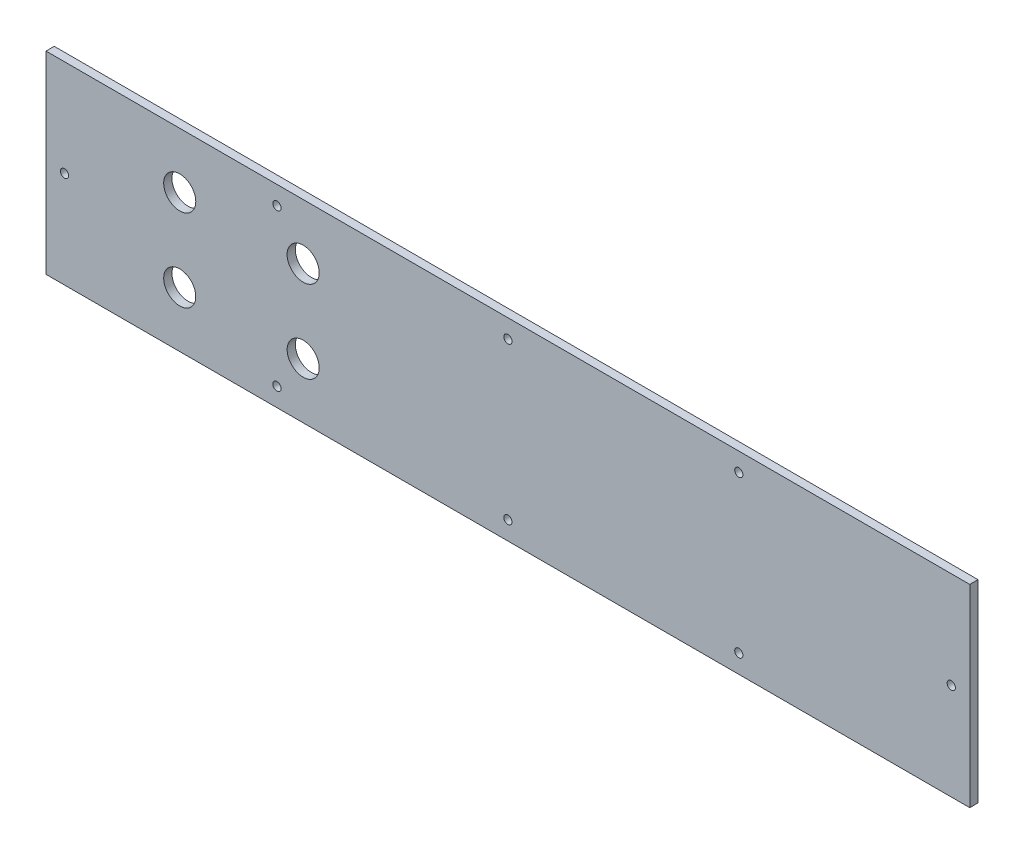
ISO-10303-21;
HEADER;
FILE_DESCRIPTION(('STEP AP214'),'2;1');
FILE_NAME('part.step','',(''),(''),'','','');
FILE_SCHEMA(('AUTOMOTIVE_DESIGN { 1 0 10303 214 1 1 1 1 }'));
ENDSEC;
DATA;
#1=APPLICATION_CONTEXT('core data for automotive mechanical design processes');
#2=APPLICATION_PROTOCOL_DEFINITION('international standard','automotive_design',2000,#1);
#3=PRODUCT_CONTEXT('',#1,'mechanical');
#4=PRODUCT('Part','Part','',(#3));
#5=PRODUCT_RELATED_PRODUCT_CATEGORY('part','',(#4));
#6=PRODUCT_DEFINITION_FORMATION('','',#4);
#7=PRODUCT_DEFINITION_CONTEXT('part definition',#1,'design');
#8=PRODUCT_DEFINITION('design','',#6,#7);
#9=PRODUCT_DEFINITION_SHAPE('','',#8);
#10=(LENGTH_UNIT() NAMED_UNIT(*) SI_UNIT(.MILLI.,.METRE.));
#11=(NAMED_UNIT(*) PLANE_ANGLE_UNIT() SI_UNIT($,.RADIAN.));
#12=(NAMED_UNIT(*) SI_UNIT($,.STERADIAN.) SOLID_ANGLE_UNIT());
#13=UNCERTAINTY_MEASURE_WITH_UNIT(LENGTH_MEASURE(1.E-05),#10,'distance_accuracy_value','');
#14=(GEOMETRIC_REPRESENTATION_CONTEXT(3) GLOBAL_UNCERTAINTY_ASSIGNED_CONTEXT((#13)) GLOBAL_UNIT_ASSIGNED_CONTEXT((#10,
#11,#12)) REPRESENTATION_CONTEXT('',''));
#15=CARTESIAN_POINT('',(0.,0.,0.));
#16=DIRECTION('',(0.,0.,1.));
#17=DIRECTION('',(1.,0.,0.));
#18=AXIS2_PLACEMENT_3D('',#15,#16,#17);
#19=CARTESIAN_POINT('',(0.,0.,4.));
#20=DIRECTION('',(0.,0.,1.));
#21=DIRECTION('',(1.,0.,0.));
#22=AXIS2_PLACEMENT_3D('',#19,#20,#21);
#23=PLANE('',#22);
#24=CARTESIAN_POINT('',(-112.25,8.99999999999618,4.));
#25=DIRECTION('',(0.,0.,1.));
#26=DIRECTION('',(1.,0.,0.));
#27=AXIS2_PLACEMENT_3D('',#24,#25,#26);
#28=CIRCLE('',#27,2.);
#29=CARTESIAN_POINT('',(-110.25,8.99999999999618,4.));
#30=VERTEX_POINT('',#29);
#31=EDGE_CURVE('E171',#30,#30,#28,.T.);
#32=ORIENTED_EDGE('',*,*,#31,.F.);
#33=EDGE_LOOP('',(#32));
#34=FACE_BOUND('',#33,.T.);
#35=CARTESIAN_POINT('',(-336.75,85.0000000000039,4.));
#36=DIRECTION('',(0.,0.,1.));
#37=DIRECTION('',(1.,0.,0.));
#38=AXIS2_PLACEMENT_3D('',#35,#36,#37);
#39=CIRCLE('',#38,2.);
#40=CARTESIAN_POINT('',(-334.75,85.0000000000039,4.));
#41=VERTEX_POINT('',#40);
#42=EDGE_CURVE('E159',#41,#41,#39,.T.);
#43=ORIENTED_EDGE('',*,*,#42,.F.);
#44=EDGE_LOOP('',(#43));
#45=FACE_BOUND('',#44,.T.);
#46=CARTESIAN_POINT('',(-384.,66.9999999999999,4.));
#47=DIRECTION('',(0.,0.,1.));
#48=DIRECTION('',(1.,0.,0.));
#49=AXIS2_PLACEMENT_3D('',#46,#47,#48);
#50=CIRCLE('',#49,7.79999999999999);
#51=CARTESIAN_POINT('',(-376.2,66.9999999999999,4.));
#52=VERTEX_POINT('',#51);
#53=EDGE_CURVE('E147',#52,#52,#50,.T.);
#54=ORIENTED_EDGE('',*,*,#53,.F.);
#55=EDGE_LOOP('',(#54));
#56=FACE_BOUND('',#55,.T.);
#57=CARTESIAN_POINT('',(-224.5,8.99999999999998,4.));
#58=DIRECTION('',(0.,0.,1.));
#59=DIRECTION('',(-1.,0.,0.));
#60=AXIS2_PLACEMENT_3D('',#57,#58,#59);
#61=CIRCLE('',#60,2.);
#62=CARTESIAN_POINT('',(-226.5,8.99999999999998,4.));
#63=VERTEX_POINT('',#62);
#64=EDGE_CURVE('E135',#63,#63,#61,.T.);
#65=ORIENTED_EDGE('',*,*,#64,.F.);
#66=EDGE_LOOP('',(#65));
#67=FACE_BOUND('',#66,.T.);
#68=CARTESIAN_POINT('',(-9.,46.9999999999999,4.));
#69=DIRECTION('',(0.,0.,1.));
#70=DIRECTION('',(1.,0.,0.));
#71=AXIS2_PLACEMENT_3D('',#68,#69,#70);
#72=CIRCLE('',#71,2.);
#73=CARTESIAN_POINT('',(-7.,46.9999999999999,4.));
#74=VERTEX_POINT('',#73);
#75=EDGE_CURVE('E123',#74,#74,#72,.T.);
#76=ORIENTED_EDGE('',*,*,#75,.F.);
#77=EDGE_LOOP('',(#76));
#78=FACE_BOUND('',#77,.T.);
#79=CARTESIAN_POINT('',(-384.,26.9999999999999,4.));
#80=DIRECTION('',(0.,0.,1.));
#81=DIRECTION('',(-1.,0.,0.));
#82=AXIS2_PLACEMENT_3D('',#79,#80,#81);
#83=CIRCLE('',#82,7.79999999999999);
#84=CARTESIAN_POINT('',(-391.8,26.9999999999999,4.));
#85=VERTEX_POINT('',#84);
#86=EDGE_CURVE('E102',#85,#85,#83,.T.);
#87=ORIENTED_EDGE('',*,*,#86,.F.);
#88=EDGE_LOOP('',(#87));
#89=FACE_BOUND('',#88,.T.);
#90=DIRECTION('',(0.,1.,0.));
#91=VECTOR('',#90,1.);
#92=CARTESIAN_POINT('',(0.,0.,4.));
#93=LINE('',#92,#91);
#94=CARTESIAN_POINT('',(0.,0.,4.));
#95=VERTEX_POINT('',#94);
#96=CARTESIAN_POINT('',(0.,93.9999999999999,4.));
#97=VERTEX_POINT('',#96);
#98=EDGE_CURVE('E87',#95,#97,#93,.T.);
#99=ORIENTED_EDGE('',*,*,#98,.T.);
#100=DIRECTION('',(-1.,0.,0.));
#101=VECTOR('',#100,1.);
#102=CARTESIAN_POINT('',(0.,93.9999999999999,4.));
#103=LINE('',#102,#101);
#104=CARTESIAN_POINT('',(-449.,93.9999999999999,4.));
#105=VERTEX_POINT('',#104);
#106=EDGE_CURVE('E82',#97,#105,#103,.T.);
#107=ORIENTED_EDGE('',*,*,#106,.T.);
#108=DIRECTION('',(0.,-1.,0.));
#109=VECTOR('',#108,1.);
#110=CARTESIAN_POINT('',(-449.,0.,4.));
#111=LINE('',#110,#109);
#112=CARTESIAN_POINT('',(-449.,0.,4.));
#113=VERTEX_POINT('',#112);
#114=EDGE_CURVE('E85',#105,#113,#111,.T.);
#115=ORIENTED_EDGE('',*,*,#114,.T.);
#116=DIRECTION('',(1.,0.,0.));
#117=VECTOR('',#116,1.);
#118=CARTESIAN_POINT('',(0.,0.,4.));
#119=LINE('',#118,#117);
#120=EDGE_CURVE('E52',#113,#95,#119,.T.);
#121=ORIENTED_EDGE('',*,*,#120,.T.);
#122=EDGE_LOOP('',(#99,#107,#115,#121));
#123=FACE_BOUND('',#122,.T.);
#124=CARTESIAN_POINT('',(-224.5,84.9999999999999,4.));
#125=DIRECTION('',(0.,0.,1.));
#126=DIRECTION('',(1.,0.,0.));
#127=AXIS2_PLACEMENT_3D('',#124,#125,#126);
#128=CIRCLE('',#127,2.);
#129=CARTESIAN_POINT('',(-222.5,84.9999999999999,4.));
#130=VERTEX_POINT('',#129);
#131=EDGE_CURVE('E117',#130,#130,#128,.T.);
#132=ORIENTED_EDGE('',*,*,#131,.F.);
#133=EDGE_LOOP('',(#132));
#134=FACE_BOUND('',#133,.T.);
#135=CARTESIAN_POINT('',(-440.,46.9999999999999,4.));
#136=DIRECTION('',(0.,0.,1.));
#137=DIRECTION('',(-1.,0.,0.));
#138=AXIS2_PLACEMENT_3D('',#135,#136,#137);
#139=CIRCLE('',#138,2.);
#140=CARTESIAN_POINT('',(-442.,46.9999999999999,4.));
#141=VERTEX_POINT('',#140);
#142=EDGE_CURVE('E129',#141,#141,#139,.T.);
#143=ORIENTED_EDGE('',*,*,#142,.F.);
#144=EDGE_LOOP('',(#143));
#145=FACE_BOUND('',#144,.T.);
#146=CARTESIAN_POINT('',(-324.,26.9999999999999,4.));
#147=DIRECTION('',(0.,0.,1.));
#148=DIRECTION('',(1.,0.,0.));
#149=AXIS2_PLACEMENT_3D('',#146,#147,#148);
#150=CIRCLE('',#149,7.79999999999999);
#151=CARTESIAN_POINT('',(-316.2,26.9999999999999,4.));
#152=VERTEX_POINT('',#151);
#153=EDGE_CURVE('E141',#152,#152,#150,.T.);
#154=ORIENTED_EDGE('',*,*,#153,.F.);
#155=EDGE_LOOP('',(#154));
#156=FACE_BOUND('',#155,.T.);
#157=CARTESIAN_POINT('',(-324.,66.9999999999999,4.));
#158=DIRECTION('',(0.,0.,1.));
#159=DIRECTION('',(-1.,0.,0.));
#160=AXIS2_PLACEMENT_3D('',#157,#158,#159);
#161=CIRCLE('',#160,7.79999999999999);
#162=CARTESIAN_POINT('',(-331.8,66.9999999999999,4.));
#163=VERTEX_POINT('',#162);
#164=EDGE_CURVE('E153',#163,#163,#161,.T.);
#165=ORIENTED_EDGE('',*,*,#164,.F.);
#166=EDGE_LOOP('',(#165));
#167=FACE_BOUND('',#166,.T.);
#168=CARTESIAN_POINT('',(-336.75,8.99999999999596,4.));
#169=DIRECTION('',(0.,0.,1.));
#170=DIRECTION('',(-1.,0.,0.));
#171=AXIS2_PLACEMENT_3D('',#168,#169,#170);
#172=CIRCLE('',#171,2.);
#173=CARTESIAN_POINT('',(-338.75,8.99999999999596,4.));
#174=VERTEX_POINT('',#173);
#175=EDGE_CURVE('E165',#174,#174,#172,.T.);
#176=ORIENTED_EDGE('',*,*,#175,.F.);
#177=EDGE_LOOP('',(#176));
#178=FACE_BOUND('',#177,.T.);
#179=CARTESIAN_POINT('',(-112.25,85.0000000000041,4.));
#180=DIRECTION('',(0.,0.,1.));
#181=DIRECTION('',(-1.,0.,0.));
#182=AXIS2_PLACEMENT_3D('',#179,#180,#181);
#183=CIRCLE('',#182,2.);
#184=CARTESIAN_POINT('',(-114.25,85.0000000000041,4.));
#185=VERTEX_POINT('',#184);
#186=EDGE_CURVE('E177',#185,#185,#183,.T.);
#187=ORIENTED_EDGE('',*,*,#186,.F.);
#188=EDGE_LOOP('',(#187));
#189=FACE_BOUND('',#188,.T.);
#190=ADVANCED_FACE('F35',(#34,#45,#56,#67,#78,#89,#123,#134,#145,#156,#167,#178,#189),#23,.T.);
#191=CARTESIAN_POINT('',(0.,0.,0.));
#192=DIRECTION('',(0.,0.,1.));
#193=DIRECTION('',(1.,0.,0.));
#194=AXIS2_PLACEMENT_3D('',#191,#192,#193);
#195=PLANE('',#194);
#196=CARTESIAN_POINT('',(-112.25,8.99999999999618,0.));
#197=DIRECTION('',(0.,0.,1.));
#198=DIRECTION('',(1.,0.,0.));
#199=AXIS2_PLACEMENT_3D('',#196,#197,#198);
#200=CIRCLE('',#199,2.);
#201=CARTESIAN_POINT('',(-110.25,8.99999999999618,0.));
#202=VERTEX_POINT('',#201);
#203=EDGE_CURVE('E174',#202,#202,#200,.T.);
#204=ORIENTED_EDGE('',*,*,#203,.T.);
#205=EDGE_LOOP('',(#204));
#206=FACE_BOUND('',#205,.T.);
#207=CARTESIAN_POINT('',(-336.75,85.0000000000039,0.));
#208=DIRECTION('',(0.,0.,1.));
#209=DIRECTION('',(1.,0.,0.));
#210=AXIS2_PLACEMENT_3D('',#207,#208,#209);
#211=CIRCLE('',#210,2.);
#212=CARTESIAN_POINT('',(-334.75,85.0000000000039,0.));
#213=VERTEX_POINT('',#212);
#214=EDGE_CURVE('E162',#213,#213,#211,.T.);
#215=ORIENTED_EDGE('',*,*,#214,.T.);
#216=EDGE_LOOP('',(#215));
#217=FACE_BOUND('',#216,.T.);
#218=CARTESIAN_POINT('',(-384.,66.9999999999999,0.));
#219=DIRECTION('',(0.,0.,1.));
#220=DIRECTION('',(1.,0.,0.));
#221=AXIS2_PLACEMENT_3D('',#218,#219,#220);
#222=CIRCLE('',#221,7.79999999999999);
#223=CARTESIAN_POINT('',(-376.2,66.9999999999999,0.));
#224=VERTEX_POINT('',#223);
#225=EDGE_CURVE('E150',#224,#224,#222,.T.);
#226=ORIENTED_EDGE('',*,*,#225,.T.);
#227=EDGE_LOOP('',(#226));
#228=FACE_BOUND('',#227,.T.);
#229=CARTESIAN_POINT('',(-224.5,8.99999999999998,0.));
#230=DIRECTION('',(0.,0.,1.));
#231=DIRECTION('',(-1.,0.,0.));
#232=AXIS2_PLACEMENT_3D('',#229,#230,#231);
#233=CIRCLE('',#232,2.);
#234=CARTESIAN_POINT('',(-226.5,8.99999999999998,0.));
#235=VERTEX_POINT('',#234);
#236=EDGE_CURVE('E138',#235,#235,#233,.T.);
#237=ORIENTED_EDGE('',*,*,#236,.T.);
#238=EDGE_LOOP('',(#237));
#239=FACE_BOUND('',#238,.T.);
#240=CARTESIAN_POINT('',(-9.,46.9999999999999,0.));
#241=DIRECTION('',(0.,0.,1.));
#242=DIRECTION('',(1.,0.,0.));
#243=AXIS2_PLACEMENT_3D('',#240,#241,#242);
#244=CIRCLE('',#243,2.);
#245=CARTESIAN_POINT('',(-7.,46.9999999999999,0.));
#246=VERTEX_POINT('',#245);
#247=EDGE_CURVE('E126',#246,#246,#244,.T.);
#248=ORIENTED_EDGE('',*,*,#247,.T.);
#249=EDGE_LOOP('',(#248));
#250=FACE_BOUND('',#249,.T.);
#251=CARTESIAN_POINT('',(-384.,26.9999999999999,0.));
#252=DIRECTION('',(0.,0.,1.));
#253=DIRECTION('',(-1.,0.,0.));
#254=AXIS2_PLACEMENT_3D('',#251,#252,#253);
#255=CIRCLE('',#254,7.79999999999999);
#256=CARTESIAN_POINT('',(-391.8,26.9999999999999,0.));
#257=VERTEX_POINT('',#256);
#258=EDGE_CURVE('E114',#257,#257,#255,.T.);
#259=ORIENTED_EDGE('',*,*,#258,.T.);
#260=EDGE_LOOP('',(#259));
#261=FACE_BOUND('',#260,.T.);
#262=DIRECTION('',(0.,1.,0.));
#263=VECTOR('',#262,1.);
#264=CARTESIAN_POINT('',(0.,0.,0.));
#265=LINE('',#264,#263);
#266=CARTESIAN_POINT('',(0.,0.,0.));
#267=VERTEX_POINT('',#266);
#268=CARTESIAN_POINT('',(0.,93.9999999999999,0.));
#269=VERTEX_POINT('',#268);
#270=EDGE_CURVE('E99',#267,#269,#265,.T.);
#271=ORIENTED_EDGE('',*,*,#270,.F.);
#272=DIRECTION('',(1.,0.,0.));
#273=VECTOR('',#272,1.);
#274=CARTESIAN_POINT('',(0.,0.,0.));
#275=LINE('',#274,#273);
#276=CARTESIAN_POINT('',(-449.,0.,0.));
#277=VERTEX_POINT('',#276);
#278=EDGE_CURVE('E75',#277,#267,#275,.T.);
#279=ORIENTED_EDGE('',*,*,#278,.F.);
#280=DIRECTION('',(0.,-1.,0.));
#281=VECTOR('',#280,1.);
#282=CARTESIAN_POINT('',(-449.,0.,0.));
#283=LINE('',#282,#281);
#284=CARTESIAN_POINT('',(-449.,93.9999999999999,0.));
#285=VERTEX_POINT('',#284);
#286=EDGE_CURVE('E69',#285,#277,#283,.T.);
#287=ORIENTED_EDGE('',*,*,#286,.F.);
#288=DIRECTION('',(-1.,0.,0.));
#289=VECTOR('',#288,1.);
#290=CARTESIAN_POINT('',(0.,93.9999999999999,0.));
#291=LINE('',#290,#289);
#292=EDGE_CURVE('E91',#269,#285,#291,.T.);
#293=ORIENTED_EDGE('',*,*,#292,.F.);
#294=EDGE_LOOP('',(#271,#279,#287,#293));
#295=FACE_BOUND('',#294,.T.);
#296=CARTESIAN_POINT('',(-224.5,84.9999999999999,0.));
#297=DIRECTION('',(0.,0.,1.));
#298=DIRECTION('',(1.,0.,0.));
#299=AXIS2_PLACEMENT_3D('',#296,#297,#298);
#300=CIRCLE('',#299,2.);
#301=CARTESIAN_POINT('',(-222.5,84.9999999999999,0.));
#302=VERTEX_POINT('',#301);
#303=EDGE_CURVE('E120',#302,#302,#300,.T.);
#304=ORIENTED_EDGE('',*,*,#303,.T.);
#305=EDGE_LOOP('',(#304));
#306=FACE_BOUND('',#305,.T.);
#307=CARTESIAN_POINT('',(-440.,46.9999999999999,0.));
#308=DIRECTION('',(0.,0.,1.));
#309=DIRECTION('',(-1.,0.,0.));
#310=AXIS2_PLACEMENT_3D('',#307,#308,#309);
#311=CIRCLE('',#310,2.);
#312=CARTESIAN_POINT('',(-442.,46.9999999999999,0.));
#313=VERTEX_POINT('',#312);
#314=EDGE_CURVE('E132',#313,#313,#311,.T.);
#315=ORIENTED_EDGE('',*,*,#314,.T.);
#316=EDGE_LOOP('',(#315));
#317=FACE_BOUND('',#316,.T.);
#318=CARTESIAN_POINT('',(-324.,26.9999999999999,0.));
#319=DIRECTION('',(0.,0.,1.));
#320=DIRECTION('',(1.,0.,0.));
#321=AXIS2_PLACEMENT_3D('',#318,#319,#320);
#322=CIRCLE('',#321,7.79999999999999);
#323=CARTESIAN_POINT('',(-316.2,26.9999999999999,0.));
#324=VERTEX_POINT('',#323);
#325=EDGE_CURVE('E144',#324,#324,#322,.T.);
#326=ORIENTED_EDGE('',*,*,#325,.T.);
#327=EDGE_LOOP('',(#326));
#328=FACE_BOUND('',#327,.T.);
#329=CARTESIAN_POINT('',(-324.,66.9999999999999,0.));
#330=DIRECTION('',(0.,0.,1.));
#331=DIRECTION('',(-1.,0.,0.));
#332=AXIS2_PLACEMENT_3D('',#329,#330,#331);
#333=CIRCLE('',#332,7.79999999999999);
#334=CARTESIAN_POINT('',(-331.8,66.9999999999999,0.));
#335=VERTEX_POINT('',#334);
#336=EDGE_CURVE('E156',#335,#335,#333,.T.);
#337=ORIENTED_EDGE('',*,*,#336,.T.);
#338=EDGE_LOOP('',(#337));
#339=FACE_BOUND('',#338,.T.);
#340=CARTESIAN_POINT('',(-336.75,8.99999999999596,0.));
#341=DIRECTION('',(0.,0.,1.));
#342=DIRECTION('',(-1.,0.,0.));
#343=AXIS2_PLACEMENT_3D('',#340,#341,#342);
#344=CIRCLE('',#343,2.);
#345=CARTESIAN_POINT('',(-338.75,8.99999999999596,0.));
#346=VERTEX_POINT('',#345);
#347=EDGE_CURVE('E168',#346,#346,#344,.T.);
#348=ORIENTED_EDGE('',*,*,#347,.T.);
#349=EDGE_LOOP('',(#348));
#350=FACE_BOUND('',#349,.T.);
#351=CARTESIAN_POINT('',(-112.25,85.0000000000041,0.));
#352=DIRECTION('',(0.,0.,1.));
#353=DIRECTION('',(-1.,0.,0.));
#354=AXIS2_PLACEMENT_3D('',#351,#352,#353);
#355=CIRCLE('',#354,2.);
#356=CARTESIAN_POINT('',(-114.25,85.0000000000041,0.));
#357=VERTEX_POINT('',#356);
#358=EDGE_CURVE('E180',#357,#357,#355,.T.);
#359=ORIENTED_EDGE('',*,*,#358,.T.);
#360=EDGE_LOOP('',(#359));
#361=FACE_BOUND('',#360,.T.);
#362=ADVANCED_FACE('F110',(#206,#217,#228,#239,#250,#261,#295,#306,#317,#328,#339,#350,#361),
#195,.F.);
#363=CARTESIAN_POINT('',(0.,0.,4.));
#364=DIRECTION('',(-1.,0.,0.));
#365=DIRECTION('',(0.,0.,1.));
#366=AXIS2_PLACEMENT_3D('',#363,#364,#365);
#367=PLANE('',#366);
#368=ORIENTED_EDGE('',*,*,#270,.T.);
#369=DIRECTION('',(0.,0.,-1.));
#370=VECTOR('',#369,1.);
#371=CARTESIAN_POINT('',(0.,93.9999999999999,4.));
#372=LINE('',#371,#370);
#373=EDGE_CURVE('E11',#97,#269,#372,.T.);
#374=ORIENTED_EDGE('',*,*,#373,.F.);
#375=ORIENTED_EDGE('',*,*,#98,.F.);
#376=DIRECTION('',(0.,0.,-1.));
#377=VECTOR('',#376,1.);
#378=CARTESIAN_POINT('',(0.,0.,4.));
#379=LINE('',#378,#377);
#380=EDGE_CURVE('E95',#95,#267,#379,.T.);
#381=ORIENTED_EDGE('',*,*,#380,.T.);
#382=EDGE_LOOP('',(#368,#374,#375,#381));
#383=FACE_BOUND('',#382,.T.);
#384=ADVANCED_FACE('F37',(#383),#367,.F.);
#385=CARTESIAN_POINT('',(0.,93.9999999999999,4.));
#386=DIRECTION('',(0.,-1.,0.));
#387=DIRECTION('',(1.,0.,0.));
#388=AXIS2_PLACEMENT_3D('',#385,#386,#387);
#389=PLANE('',#388);
#390=ORIENTED_EDGE('',*,*,#292,.T.);
#391=DIRECTION('',(0.,0.,-1.));
#392=VECTOR('',#391,1.);
#393=CARTESIAN_POINT('',(-449.,93.9999999999999,4.));
#394=LINE('',#393,#392);
#395=EDGE_CURVE('E44',#105,#285,#394,.T.);
#396=ORIENTED_EDGE('',*,*,#395,.F.);
#397=ORIENTED_EDGE('',*,*,#106,.F.);
#398=ORIENTED_EDGE('',*,*,#373,.T.);
#399=EDGE_LOOP('',(#390,#396,#397,#398));
#400=FACE_BOUND('',#399,.T.);
#401=ADVANCED_FACE('F90',(#400),#389,.F.);
#402=CARTESIAN_POINT('',(-449.,0.,4.));
#403=DIRECTION('',(1.,0.,0.));
#404=DIRECTION('',(0.,1.,0.));
#405=AXIS2_PLACEMENT_3D('',#402,#403,#404);
#406=PLANE('',#405);
#407=ORIENTED_EDGE('',*,*,#286,.T.);
#408=DIRECTION('',(0.,0.,-1.));
#409=VECTOR('',#408,1.);
#410=CARTESIAN_POINT('',(-449.,0.,4.));
#411=LINE('',#410,#409);
#412=EDGE_CURVE('E92',#113,#277,#411,.T.);
#413=ORIENTED_EDGE('',*,*,#412,.F.);
#414=ORIENTED_EDGE('',*,*,#114,.F.);
#415=ORIENTED_EDGE('',*,*,#395,.T.);
#416=EDGE_LOOP('',(#407,#413,#414,#415));
#417=FACE_BOUND('',#416,.T.);
#418=ADVANCED_FACE('F93',(#417),#406,.F.);
#419=CARTESIAN_POINT('',(0.,0.,4.));
#420=DIRECTION('',(0.,1.,0.));
#421=DIRECTION('',(-1.,0.,0.));
#422=AXIS2_PLACEMENT_3D('',#419,#420,#421);
#423=PLANE('',#422);
#424=ORIENTED_EDGE('',*,*,#278,.T.);
#425=ORIENTED_EDGE('',*,*,#380,.F.);
#426=ORIENTED_EDGE('',*,*,#120,.F.);
#427=ORIENTED_EDGE('',*,*,#412,.T.);
#428=EDGE_LOOP('',(#424,#425,#426,#427));
#429=FACE_BOUND('',#428,.T.);
#430=ADVANCED_FACE('F107',(#429),#423,.F.);
#431=CARTESIAN_POINT('',(-384.,26.9999999999999,4.));
#432=DIRECTION('',(0.,0.,-1.));
#433=DIRECTION('',(-1.,0.,0.));
#434=AXIS2_PLACEMENT_3D('',#431,#432,#433);
#435=CYLINDRICAL_SURFACE('',#434,7.79999999999999);
#436=ORIENTED_EDGE('',*,*,#86,.T.);
#437=EDGE_LOOP('',(#436));
#438=FACE_BOUND('',#437,.T.);
#439=ORIENTED_EDGE('',*,*,#258,.F.);
#440=EDGE_LOOP('',(#439));
#441=FACE_BOUND('',#440,.T.);
#442=ADVANCED_FACE('F200',(#438,#441),#435,.F.);
#443=CARTESIAN_POINT('',(-224.5,84.9999999999999,4.));
#444=DIRECTION('',(0.,0.,-1.));
#445=DIRECTION('',(-1.,0.,0.));
#446=AXIS2_PLACEMENT_3D('',#443,#444,#445);
#447=CYLINDRICAL_SURFACE('',#446,2.);
#448=ORIENTED_EDGE('',*,*,#131,.T.);
#449=EDGE_LOOP('',(#448));
#450=FACE_BOUND('',#449,.T.);
#451=ORIENTED_EDGE('',*,*,#303,.F.);
#452=EDGE_LOOP('',(#451));
#453=FACE_BOUND('',#452,.T.);
#454=ADVANCED_FACE('F248',(#450,#453),#447,.F.);
#455=CARTESIAN_POINT('',(-9.,46.9999999999999,4.));
#456=DIRECTION('',(0.,0.,-1.));
#457=DIRECTION('',(-1.,0.,0.));
#458=AXIS2_PLACEMENT_3D('',#455,#456,#457);
#459=CYLINDRICAL_SURFACE('',#458,2.);
#460=ORIENTED_EDGE('',*,*,#75,.T.);
#461=EDGE_LOOP('',(#460));
#462=FACE_BOUND('',#461,.T.);
#463=ORIENTED_EDGE('',*,*,#247,.F.);
#464=EDGE_LOOP('',(#463));
#465=FACE_BOUND('',#464,.T.);
#466=ADVANCED_FACE('F256',(#462,#465),#459,.F.);
#467=CARTESIAN_POINT('',(-440.,46.9999999999999,4.));
#468=DIRECTION('',(0.,0.,-1.));
#469=DIRECTION('',(-1.,0.,0.));
#470=AXIS2_PLACEMENT_3D('',#467,#468,#469);
#471=CYLINDRICAL_SURFACE('',#470,2.);
#472=ORIENTED_EDGE('',*,*,#142,.T.);
#473=EDGE_LOOP('',(#472));
#474=FACE_BOUND('',#473,.T.);
#475=ORIENTED_EDGE('',*,*,#314,.F.);
#476=EDGE_LOOP('',(#475));
#477=FACE_BOUND('',#476,.T.);
#478=ADVANCED_FACE('F264',(#474,#477),#471,.F.);
#479=CARTESIAN_POINT('',(-224.5,8.99999999999998,4.));
#480=DIRECTION('',(0.,0.,-1.));
#481=DIRECTION('',(-1.,0.,0.));
#482=AXIS2_PLACEMENT_3D('',#479,#480,#481);
#483=CYLINDRICAL_SURFACE('',#482,2.);
#484=ORIENTED_EDGE('',*,*,#64,.T.);
#485=EDGE_LOOP('',(#484));
#486=FACE_BOUND('',#485,.T.);
#487=ORIENTED_EDGE('',*,*,#236,.F.);
#488=EDGE_LOOP('',(#487));
#489=FACE_BOUND('',#488,.T.);
#490=ADVANCED_FACE('F273',(#486,#489),#483,.F.);
#491=CARTESIAN_POINT('',(-324.,26.9999999999999,4.));
#492=DIRECTION('',(0.,0.,-1.));
#493=DIRECTION('',(-1.,0.,0.));
#494=AXIS2_PLACEMENT_3D('',#491,#492,#493);
#495=CYLINDRICAL_SURFACE('',#494,7.79999999999999);
#496=ORIENTED_EDGE('',*,*,#153,.T.);
#497=EDGE_LOOP('',(#496));
#498=FACE_BOUND('',#497,.T.);
#499=ORIENTED_EDGE('',*,*,#325,.F.);
#500=EDGE_LOOP('',(#499));
#501=FACE_BOUND('',#500,.T.);
#502=ADVANCED_FACE('F282',(#498,#501),#495,.F.);
#503=CARTESIAN_POINT('',(-384.,66.9999999999999,4.));
#504=DIRECTION('',(0.,0.,-1.));
#505=DIRECTION('',(-1.,0.,0.));
#506=AXIS2_PLACEMENT_3D('',#503,#504,#505);
#507=CYLINDRICAL_SURFACE('',#506,7.79999999999999);
#508=ORIENTED_EDGE('',*,*,#53,.T.);
#509=EDGE_LOOP('',(#508));
#510=FACE_BOUND('',#509,.T.);
#511=ORIENTED_EDGE('',*,*,#225,.F.);
#512=EDGE_LOOP('',(#511));
#513=FACE_BOUND('',#512,.T.);
#514=ADVANCED_FACE('F291',(#510,#513),#507,.F.);
#515=CARTESIAN_POINT('',(-324.,66.9999999999999,4.));
#516=DIRECTION('',(0.,0.,-1.));
#517=DIRECTION('',(-1.,0.,0.));
#518=AXIS2_PLACEMENT_3D('',#515,#516,#517);
#519=CYLINDRICAL_SURFACE('',#518,7.79999999999999);
#520=ORIENTED_EDGE('',*,*,#164,.T.);
#521=EDGE_LOOP('',(#520));
#522=FACE_BOUND('',#521,.T.);
#523=ORIENTED_EDGE('',*,*,#336,.F.);
#524=EDGE_LOOP('',(#523));
#525=FACE_BOUND('',#524,.T.);
#526=ADVANCED_FACE('F300',(#522,#525),#519,.F.);
#527=CARTESIAN_POINT('',(-336.75,85.0000000000039,4.));
#528=DIRECTION('',(0.,0.,-1.));
#529=DIRECTION('',(-1.,0.,0.));
#530=AXIS2_PLACEMENT_3D('',#527,#528,#529);
#531=CYLINDRICAL_SURFACE('',#530,2.);
#532=ORIENTED_EDGE('',*,*,#42,.T.);
#533=EDGE_LOOP('',(#532));
#534=FACE_BOUND('',#533,.T.);
#535=ORIENTED_EDGE('',*,*,#214,.F.);
#536=EDGE_LOOP('',(#535));
#537=FACE_BOUND('',#536,.T.);
#538=ADVANCED_FACE('F309',(#534,#537),#531,.F.);
#539=CARTESIAN_POINT('',(-336.75,8.99999999999596,4.));
#540=DIRECTION('',(0.,0.,-1.));
#541=DIRECTION('',(-1.,0.,0.));
#542=AXIS2_PLACEMENT_3D('',#539,#540,#541);
#543=CYLINDRICAL_SURFACE('',#542,2.);
#544=ORIENTED_EDGE('',*,*,#175,.T.);
#545=EDGE_LOOP('',(#544));
#546=FACE_BOUND('',#545,.T.);
#547=ORIENTED_EDGE('',*,*,#347,.F.);
#548=EDGE_LOOP('',(#547));
#549=FACE_BOUND('',#548,.T.);
#550=ADVANCED_FACE('F318',(#546,#549),#543,.F.);
#551=CARTESIAN_POINT('',(-112.25,8.99999999999618,4.));
#552=DIRECTION('',(0.,0.,-1.));
#553=DIRECTION('',(-1.,0.,0.));
#554=AXIS2_PLACEMENT_3D('',#551,#552,#553);
#555=CYLINDRICAL_SURFACE('',#554,2.);
#556=ORIENTED_EDGE('',*,*,#31,.T.);
#557=EDGE_LOOP('',(#556));
#558=FACE_BOUND('',#557,.T.);
#559=ORIENTED_EDGE('',*,*,#203,.F.);
#560=EDGE_LOOP('',(#559));
#561=FACE_BOUND('',#560,.T.);
#562=ADVANCED_FACE('F327',(#558,#561),#555,.F.);
#563=CARTESIAN_POINT('',(-112.25,85.0000000000041,4.));
#564=DIRECTION('',(0.,0.,-1.));
#565=DIRECTION('',(-1.,0.,0.));
#566=AXIS2_PLACEMENT_3D('',#563,#564,#565);
#567=CYLINDRICAL_SURFACE('',#566,2.);
#568=ORIENTED_EDGE('',*,*,#186,.T.);
#569=EDGE_LOOP('',(#568));
#570=FACE_BOUND('',#569,.T.);
#571=ORIENTED_EDGE('',*,*,#358,.F.);
#572=EDGE_LOOP('',(#571));
#573=FACE_BOUND('',#572,.T.);
#574=ADVANCED_FACE('F186',(#570,#573),#567,.F.);
#575=CLOSED_SHELL('',(#190,#362,#384,#401,#418,#430,#442,#454,#466,#478,#490,#502,#514,#526,
#538,#550,#562,#574));
#576=MANIFOLD_SOLID_BREP('B2',#575);
#577=ADVANCED_BREP_SHAPE_REPRESENTATION('',(#18,#576),#14);
#578=SHAPE_DEFINITION_REPRESENTATION(#9,#577);
ENDSEC;
END-ISO-10303-21;
